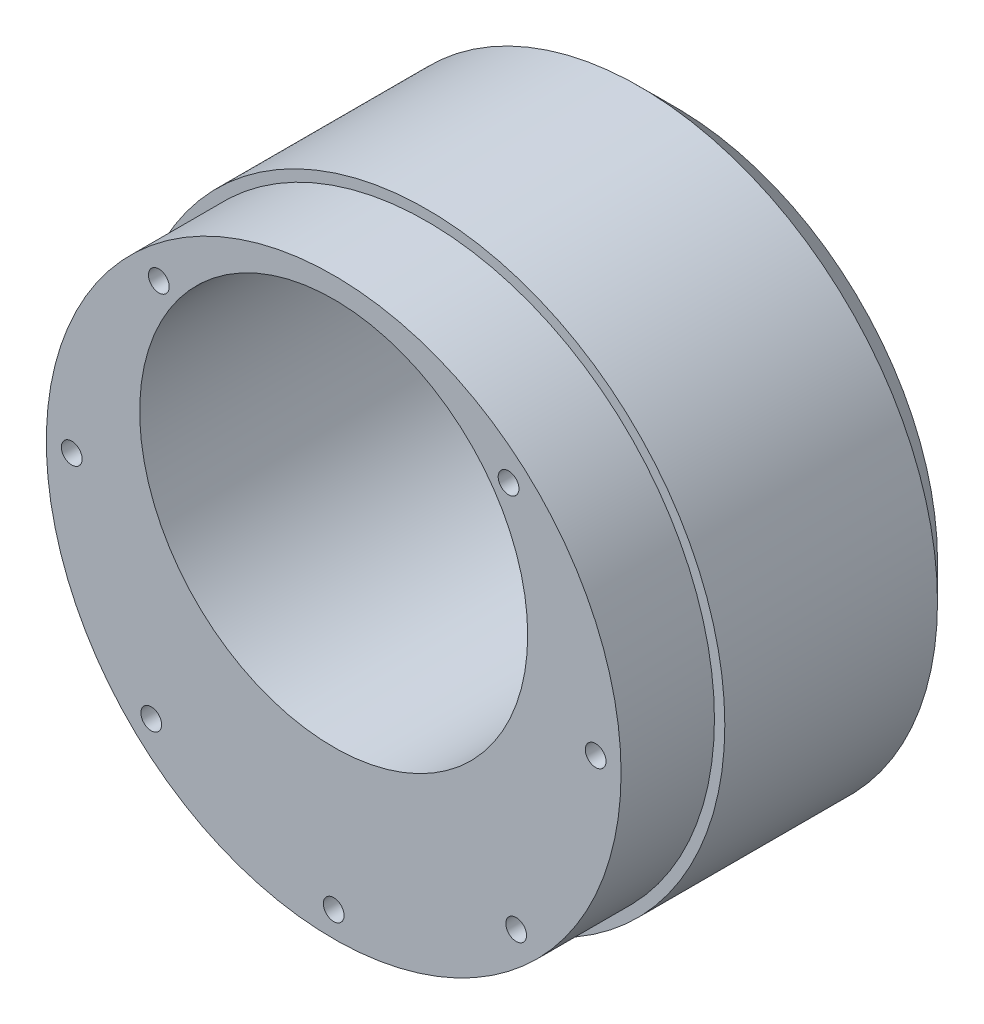
ISO-10303-21;
HEADER;
FILE_DESCRIPTION(('STEP AP214'),'2;1');
FILE_NAME('part.step','',(''),(''),'','','');
FILE_SCHEMA(('AUTOMOTIVE_DESIGN { 1 0 10303 214 1 1 1 1 }'));
ENDSEC;
DATA;
#1=APPLICATION_CONTEXT('core data for automotive mechanical design processes');
#2=APPLICATION_PROTOCOL_DEFINITION('international standard','automotive_design',2000,#1);
#3=PRODUCT_CONTEXT('',#1,'mechanical');
#4=PRODUCT('Part','Part','',(#3));
#5=PRODUCT_RELATED_PRODUCT_CATEGORY('part','',(#4));
#6=PRODUCT_DEFINITION_FORMATION('','',#4);
#7=PRODUCT_DEFINITION_CONTEXT('part definition',#1,'design');
#8=PRODUCT_DEFINITION('design','',#6,#7);
#9=PRODUCT_DEFINITION_SHAPE('','',#8);
#10=(LENGTH_UNIT() NAMED_UNIT(*) SI_UNIT(.MILLI.,.METRE.));
#11=(NAMED_UNIT(*) PLANE_ANGLE_UNIT() SI_UNIT($,.RADIAN.));
#12=(NAMED_UNIT(*) SI_UNIT($,.STERADIAN.) SOLID_ANGLE_UNIT());
#13=UNCERTAINTY_MEASURE_WITH_UNIT(LENGTH_MEASURE(1.E-05),#10,'distance_accuracy_value','');
#14=(GEOMETRIC_REPRESENTATION_CONTEXT(3) GLOBAL_UNCERTAINTY_ASSIGNED_CONTEXT((#13)) GLOBAL_UNIT_ASSIGNED_CONTEXT((#10,
#11,#12)) REPRESENTATION_CONTEXT('',''));
#15=CARTESIAN_POINT('',(0.,0.,0.));
#16=DIRECTION('',(0.,0.,1.));
#17=DIRECTION('',(1.,0.,0.));
#18=AXIS2_PLACEMENT_3D('',#15,#16,#17);
#19=CARTESIAN_POINT('',(15.5,7.,33.));
#20=DIRECTION('',(0.,0.,-1.));
#21=DIRECTION('',(-1.,0.,0.));
#22=AXIS2_PLACEMENT_3D('',#19,#20,#21);
#23=CYLINDRICAL_SURFACE('',#22,1.65);
#24=CARTESIAN_POINT('',(15.5,7.,3.50000000000003));
#25=DIRECTION('',(0.,0.,-1.));
#26=DIRECTION('',(-1.,0.,0.));
#27=AXIS2_PLACEMENT_3D('',#24,#25,#26);
#28=CIRCLE('',#27,1.65);
#29=CARTESIAN_POINT('',(13.85,7.,3.50000000000003));
#30=VERTEX_POINT('',#29);
#31=EDGE_CURVE('E73',#30,#30,#28,.T.);
#32=ORIENTED_EDGE('',*,*,#31,.T.);
#33=EDGE_LOOP('',(#32));
#34=FACE_BOUND('',#33,.T.);
#35=CARTESIAN_POINT('',(15.5,7.,6.));
#36=DIRECTION('',(0.,0.,1.));
#37=DIRECTION('',(1.,0.,0.));
#38=AXIS2_PLACEMENT_3D('',#35,#36,#37);
#39=CIRCLE('',#38,1.65);
#40=CARTESIAN_POINT('',(17.15,7.,6.));
#41=VERTEX_POINT('',#40);
#42=EDGE_CURVE('E93',#41,#41,#39,.T.);
#43=ORIENTED_EDGE('',*,*,#42,.T.);
#44=EDGE_LOOP('',(#43));
#45=FACE_BOUND('',#44,.T.);
#46=ADVANCED_FACE('F32',(#34,#45),#23,.F.);
#47=CARTESIAN_POINT('',(7.74999999999997,-6.42339375865882,33.));
#48=DIRECTION('',(0.,0.,-1.));
#49=DIRECTION('',(-1.,0.,0.));
#50=AXIS2_PLACEMENT_3D('',#47,#48,#49);
#51=CYLINDRICAL_SURFACE('',#50,1.65);
#52=CARTESIAN_POINT('',(7.74999999999997,-6.42339375865882,3.50000000000003));
#53=DIRECTION('',(0.,0.,-1.));
#54=DIRECTION('',(-1.,0.,0.));
#55=AXIS2_PLACEMENT_3D('',#52,#53,#54);
#56=CIRCLE('',#55,1.65);
#57=CARTESIAN_POINT('',(6.09999999999997,-6.42339375865882,3.50000000000003));
#58=VERTEX_POINT('',#57);
#59=EDGE_CURVE('E70',#58,#58,#56,.T.);
#60=ORIENTED_EDGE('',*,*,#59,.T.);
#61=EDGE_LOOP('',(#60));
#62=FACE_BOUND('',#61,.T.);
#63=CARTESIAN_POINT('',(7.74999999999997,-6.42339375865882,6.));
#64=DIRECTION('',(0.,0.,1.));
#65=DIRECTION('',(1.,0.,0.));
#66=AXIS2_PLACEMENT_3D('',#63,#64,#65);
#67=CIRCLE('',#66,1.65);
#68=CARTESIAN_POINT('',(9.39999999999996,-6.42339375865882,6.));
#69=VERTEX_POINT('',#68);
#70=EDGE_CURVE('E96',#69,#69,#67,.T.);
#71=ORIENTED_EDGE('',*,*,#70,.T.);
#72=EDGE_LOOP('',(#71));
#73=FACE_BOUND('',#72,.T.);
#74=ADVANCED_FACE('F250',(#62,#73),#51,.F.);
#75=CARTESIAN_POINT('',(-7.75000000000006,-6.42339375865876,33.));
#76=DIRECTION('',(0.,0.,-1.));
#77=DIRECTION('',(-1.,0.,0.));
#78=AXIS2_PLACEMENT_3D('',#75,#76,#77);
#79=CYLINDRICAL_SURFACE('',#78,1.65);
#80=CARTESIAN_POINT('',(-7.75000000000006,-6.42339375865876,3.50000000000003));
#81=DIRECTION('',(0.,0.,-1.));
#82=DIRECTION('',(-1.,0.,0.));
#83=AXIS2_PLACEMENT_3D('',#80,#81,#82);
#84=CIRCLE('',#83,1.65);
#85=CARTESIAN_POINT('',(-9.40000000000007,-6.42339375865876,3.50000000000003));
#86=VERTEX_POINT('',#85);
#87=EDGE_CURVE('E67',#86,#86,#84,.T.);
#88=ORIENTED_EDGE('',*,*,#87,.T.);
#89=EDGE_LOOP('',(#88));
#90=FACE_BOUND('',#89,.T.);
#91=CARTESIAN_POINT('',(-7.75000000000006,-6.42339375865876,6.));
#92=DIRECTION('',(0.,0.,1.));
#93=DIRECTION('',(1.,0.,0.));
#94=AXIS2_PLACEMENT_3D('',#91,#92,#93);
#95=CIRCLE('',#94,1.65);
#96=CARTESIAN_POINT('',(-6.10000000000006,-6.42339375865876,6.));
#97=VERTEX_POINT('',#96);
#98=EDGE_CURVE('E99',#97,#97,#95,.T.);
#99=ORIENTED_EDGE('',*,*,#98,.T.);
#100=EDGE_LOOP('',(#99));
#101=FACE_BOUND('',#100,.T.);
#102=ADVANCED_FACE('F256',(#90,#101),#79,.F.);
#103=CARTESIAN_POINT('',(-15.5,7.,33.));
#104=DIRECTION('',(0.,0.,-1.));
#105=DIRECTION('',(-1.,0.,0.));
#106=AXIS2_PLACEMENT_3D('',#103,#104,#105);
#107=CYLINDRICAL_SURFACE('',#106,1.64999999999997);
#108=CARTESIAN_POINT('',(-15.5,7.,3.50000000000003));
#109=DIRECTION('',(0.,0.,-1.));
#110=DIRECTION('',(-1.,0.,0.));
#111=AXIS2_PLACEMENT_3D('',#108,#109,#110);
#112=CIRCLE('',#111,1.64999999999997);
#113=CARTESIAN_POINT('',(-17.15,7.,3.50000000000003));
#114=VERTEX_POINT('',#113);
#115=EDGE_CURVE('E64',#114,#114,#112,.T.);
#116=ORIENTED_EDGE('',*,*,#115,.T.);
#117=EDGE_LOOP('',(#116));
#118=FACE_BOUND('',#117,.T.);
#119=CARTESIAN_POINT('',(-15.5,7.,6.));
#120=DIRECTION('',(0.,0.,1.));
#121=DIRECTION('',(1.,0.,0.));
#122=AXIS2_PLACEMENT_3D('',#119,#120,#121);
#123=CIRCLE('',#122,1.64999999999997);
#124=CARTESIAN_POINT('',(-13.85,7.,6.));
#125=VERTEX_POINT('',#124);
#126=EDGE_CURVE('E102',#125,#125,#123,.T.);
#127=ORIENTED_EDGE('',*,*,#126,.T.);
#128=EDGE_LOOP('',(#127));
#129=FACE_BOUND('',#128,.T.);
#130=ADVANCED_FACE('F300',(#118,#129),#107,.F.);
#131=CARTESIAN_POINT('',(-7.74999999999988,20.4233937586589,33.));
#132=DIRECTION('',(0.,0.,-1.));
#133=DIRECTION('',(-1.,0.,0.));
#134=AXIS2_PLACEMENT_3D('',#131,#132,#133);
#135=CYLINDRICAL_SURFACE('',#134,1.65);
#136=CARTESIAN_POINT('',(-7.74999999999988,20.4233937586589,3.50000000000003));
#137=DIRECTION('',(0.,0.,-1.));
#138=DIRECTION('',(-1.,0.,0.));
#139=AXIS2_PLACEMENT_3D('',#136,#137,#138);
#140=CIRCLE('',#139,1.65);
#141=CARTESIAN_POINT('',(-9.39999999999988,20.4233937586589,3.50000000000003));
#142=VERTEX_POINT('',#141);
#143=EDGE_CURVE('E61',#142,#142,#140,.T.);
#144=ORIENTED_EDGE('',*,*,#143,.T.);
#145=EDGE_LOOP('',(#144));
#146=FACE_BOUND('',#145,.T.);
#147=CARTESIAN_POINT('',(-7.74999999999988,20.4233937586589,6.));
#148=DIRECTION('',(0.,0.,1.));
#149=DIRECTION('',(1.,0.,0.));
#150=AXIS2_PLACEMENT_3D('',#147,#148,#149);
#151=CIRCLE('',#150,1.65);
#152=CARTESIAN_POINT('',(-6.09999999999987,20.4233937586589,6.));
#153=VERTEX_POINT('',#152);
#154=EDGE_CURVE('E86',#153,#153,#151,.T.);
#155=ORIENTED_EDGE('',*,*,#154,.T.);
#156=EDGE_LOOP('',(#155));
#157=FACE_BOUND('',#156,.T.);
#158=ADVANCED_FACE('F297',(#146,#157),#135,.F.);
#159=CARTESIAN_POINT('',(7.75000000000016,20.4233937586587,33.));
#160=DIRECTION('',(0.,0.,-1.));
#161=DIRECTION('',(-1.,0.,0.));
#162=AXIS2_PLACEMENT_3D('',#159,#160,#161);
#163=CYLINDRICAL_SURFACE('',#162,1.65);
#164=CARTESIAN_POINT('',(7.75000000000016,20.4233937586587,3.50000000000003));
#165=DIRECTION('',(0.,0.,-1.));
#166=DIRECTION('',(-1.,0.,0.));
#167=AXIS2_PLACEMENT_3D('',#164,#165,#166);
#168=CIRCLE('',#167,1.65);
#169=CARTESIAN_POINT('',(6.10000000000016,20.4233937586587,3.50000000000003));
#170=VERTEX_POINT('',#169);
#171=EDGE_CURVE('E58',#170,#170,#168,.T.);
#172=ORIENTED_EDGE('',*,*,#171,.T.);
#173=EDGE_LOOP('',(#172));
#174=FACE_BOUND('',#173,.T.);
#175=CARTESIAN_POINT('',(7.75000000000016,20.4233937586587,6.));
#176=DIRECTION('',(0.,0.,1.));
#177=DIRECTION('',(1.,0.,0.));
#178=AXIS2_PLACEMENT_3D('',#175,#176,#177);
#179=CIRCLE('',#178,1.65);
#180=CARTESIAN_POINT('',(9.40000000000015,20.4233937586587,6.));
#181=VERTEX_POINT('',#180);
#182=EDGE_CURVE('E83',#181,#181,#179,.T.);
#183=ORIENTED_EDGE('',*,*,#182,.T.);
#184=EDGE_LOOP('',(#183));
#185=FACE_BOUND('',#184,.T.);
#186=ADVANCED_FACE('F230',(#174,#185),#163,.F.);
#187=CARTESIAN_POINT('',(0.,0.,33.));
#188=DIRECTION('',(0.,0.,1.));
#189=DIRECTION('',(1.,0.,0.));
#190=AXIS2_PLACEMENT_3D('',#187,#188,#189);
#191=PLANE('',#190);
#192=CARTESIAN_POINT('',(0.,-25.25,33.));
#193=DIRECTION('',(0.,0.,1.));
#194=DIRECTION('',(1.,0.,0.));
#195=AXIS2_PLACEMENT_3D('',#192,#193,#194);
#196=CIRCLE('',#195,1.);
#197=CARTESIAN_POINT('',(1.,-25.25,33.));
#198=VERTEX_POINT('',#197);
#199=EDGE_CURVE('E159',#198,#198,#196,.T.);
#200=ORIENTED_EDGE('',*,*,#199,.F.);
#201=EDGE_LOOP('',(#200));
#202=FACE_BOUND('',#201,.T.);
#203=CARTESIAN_POINT('',(-25.248910365322,0.234574857846225,33.));
#204=DIRECTION('',(0.,0.,1.));
#205=DIRECTION('',(1.,0.,0.));
#206=AXIS2_PLACEMENT_3D('',#203,#204,#205);
#207=CIRCLE('',#206,1.);
#208=CARTESIAN_POINT('',(-24.248910365322,0.234574857846225,33.));
#209=VERTEX_POINT('',#208);
#210=EDGE_CURVE('E153',#209,#209,#207,.T.);
#211=ORIENTED_EDGE('',*,*,#210,.F.);
#212=EDGE_LOOP('',(#211));
#213=FACE_BOUND('',#212,.T.);
#214=CARTESIAN_POINT('',(-17.5874610528321,-18.1174974462566,33.));
#215=DIRECTION('',(0.,0.,1.));
#216=DIRECTION('',(1.,0.,0.));
#217=AXIS2_PLACEMENT_3D('',#214,#215,#216);
#218=CIRCLE('',#217,1.);
#219=CARTESIAN_POINT('',(-16.5874610528321,-18.1174974462566,33.));
#220=VERTEX_POINT('',#219);
#221=EDGE_CURVE('E147',#220,#220,#218,.T.);
#222=ORIENTED_EDGE('',*,*,#221,.F.);
#223=EDGE_LOOP('',(#222));
#224=FACE_BOUND('',#223,.T.);
#225=CARTESIAN_POINT('',(17.5874610528321,-18.1174974462566,33.));
#226=DIRECTION('',(0.,0.,1.));
#227=DIRECTION('',(-1.,0.,0.));
#228=AXIS2_PLACEMENT_3D('',#225,#226,#227);
#229=CIRCLE('',#228,1.);
#230=CARTESIAN_POINT('',(16.5874610528321,-18.1174974462566,33.));
#231=VERTEX_POINT('',#230);
#232=EDGE_CURVE('E141',#231,#231,#229,.T.);
#233=ORIENTED_EDGE('',*,*,#232,.F.);
#234=EDGE_LOOP('',(#233));
#235=FACE_BOUND('',#234,.T.);
#236=CARTESIAN_POINT('',(25.248910365322,0.234574857846231,33.));
#237=DIRECTION('',(0.,0.,1.));
#238=DIRECTION('',(-1.,0.,0.));
#239=AXIS2_PLACEMENT_3D('',#236,#237,#238);
#240=CIRCLE('',#239,1.);
#241=CARTESIAN_POINT('',(24.248910365322,0.234574857846231,33.));
#242=VERTEX_POINT('',#241);
#243=EDGE_CURVE('E135',#242,#242,#240,.T.);
#244=ORIENTED_EDGE('',*,*,#243,.F.);
#245=EDGE_LOOP('',(#244));
#246=FACE_BOUND('',#245,.T.);
#247=CARTESIAN_POINT('',(-16.8542728802784,18.8014889218145,33.));
#248=DIRECTION('',(0.,0.,1.));
#249=DIRECTION('',(1.,0.,0.));
#250=AXIS2_PLACEMENT_3D('',#247,#248,#249);
#251=CIRCLE('',#250,1.);
#252=CARTESIAN_POINT('',(-15.8542728802784,18.8014889218145,33.));
#253=VERTEX_POINT('',#252);
#254=EDGE_CURVE('E129',#253,#253,#251,.T.);
#255=ORIENTED_EDGE('',*,*,#254,.F.);
#256=EDGE_LOOP('',(#255));
#257=FACE_BOUND('',#256,.T.);
#258=CARTESIAN_POINT('',(16.8542728802784,18.8014889218145,33.));
#259=DIRECTION('',(0.,0.,1.));
#260=DIRECTION('',(-1.,0.,0.));
#261=AXIS2_PLACEMENT_3D('',#258,#259,#260);
#262=CIRCLE('',#261,1.);
#263=CARTESIAN_POINT('',(15.8542728802784,18.8014889218145,33.));
#264=VERTEX_POINT('',#263);
#265=EDGE_CURVE('E122',#264,#264,#262,.T.);
#266=ORIENTED_EDGE('',*,*,#265,.F.);
#267=EDGE_LOOP('',(#266));
#268=FACE_BOUND('',#267,.T.);
#269=CARTESIAN_POINT('',(0.,7.,33.));
#270=DIRECTION('',(0.,0.,1.));
#271=DIRECTION('',(1.,0.,0.));
#272=AXIS2_PLACEMENT_3D('',#269,#270,#271);
#273=CIRCLE('',#272,18.7);
#274=CARTESIAN_POINT('',(18.7,7.,33.));
#275=VERTEX_POINT('',#274);
#276=EDGE_CURVE('E107',#275,#275,#273,.T.);
#277=ORIENTED_EDGE('',*,*,#276,.F.);
#278=EDGE_LOOP('',(#277));
#279=FACE_BOUND('',#278,.T.);
#280=CARTESIAN_POINT('',(0.,0.,33.));
#281=DIRECTION('',(0.,0.,1.));
#282=DIRECTION('',(1.,0.,0.));
#283=AXIS2_PLACEMENT_3D('',#280,#281,#282);
#284=CIRCLE('',#283,27.7);
#285=CARTESIAN_POINT('',(27.7,0.,33.));
#286=VERTEX_POINT('',#285);
#287=EDGE_CURVE('E116',#286,#286,#284,.T.);
#288=ORIENTED_EDGE('',*,*,#287,.T.);
#289=EDGE_LOOP('',(#288));
#290=FACE_BOUND('',#289,.T.);
#291=ADVANCED_FACE('F227',(#202,#213,#224,#235,#246,#257,#268,#279,#290),#191,.T.);
#292=CARTESIAN_POINT('',(0.,0.,33.));
#293=DIRECTION('',(0.,0.,-1.));
#294=DIRECTION('',(-1.,0.,0.));
#295=AXIS2_PLACEMENT_3D('',#292,#293,#294);
#296=CYLINDRICAL_SURFACE('',#295,28.7);
#297=CARTESIAN_POINT('',(0.,0.,3.50000000000001));
#298=DIRECTION('',(0.,0.,1.));
#299=DIRECTION('',(1.,0.,0.));
#300=AXIS2_PLACEMENT_3D('',#297,#298,#299);
#301=CIRCLE('',#300,28.7);
#302=CARTESIAN_POINT('',(28.7,0.,3.50000000000001));
#303=VERTEX_POINT('',#302);
#304=EDGE_CURVE('E79',#303,#303,#301,.T.);
#305=ORIENTED_EDGE('',*,*,#304,.T.);
#306=EDGE_LOOP('',(#305));
#307=FACE_BOUND('',#306,.T.);
#308=CARTESIAN_POINT('',(0.,0.,24.));
#309=DIRECTION('',(0.,0.,1.));
#310=DIRECTION('',(1.,0.,0.));
#311=AXIS2_PLACEMENT_3D('',#308,#309,#310);
#312=CIRCLE('',#311,28.7);
#313=CARTESIAN_POINT('',(28.7,0.,24.));
#314=VERTEX_POINT('',#313);
#315=EDGE_CURVE('E110',#314,#314,#312,.T.);
#316=ORIENTED_EDGE('',*,*,#315,.F.);
#317=EDGE_LOOP('',(#316));
#318=FACE_BOUND('',#317,.T.);
#319=ADVANCED_FACE('F199',(#307,#318),#296,.T.);
#320=CARTESIAN_POINT('',(0.,0.,33.));
#321=DIRECTION('',(0.,0.,-1.));
#322=DIRECTION('',(-1.,0.,0.));
#323=AXIS2_PLACEMENT_3D('',#320,#321,#322);
#324=CYLINDRICAL_SURFACE('',#323,6.15);
#325=CARTESIAN_POINT('',(0.,0.,0.));
#326=DIRECTION('',(0.,0.,1.));
#327=DIRECTION('',(1.,0.,0.));
#328=AXIS2_PLACEMENT_3D('',#325,#326,#327);
#329=CIRCLE('',#328,6.15);
#330=CARTESIAN_POINT('',(6.15,0.,0.));
#331=VERTEX_POINT('',#330);
#332=EDGE_CURVE('E82',#331,#331,#329,.T.);
#333=ORIENTED_EDGE('',*,*,#332,.F.);
#334=EDGE_LOOP('',(#333));
#335=FACE_BOUND('',#334,.T.);
#336=CARTESIAN_POINT('',(0.,0.,6.));
#337=DIRECTION('',(0.,0.,1.));
#338=DIRECTION('',(1.,0.,0.));
#339=AXIS2_PLACEMENT_3D('',#336,#337,#338);
#340=CIRCLE('',#339,6.15);
#341=CARTESIAN_POINT('',(6.15,0.,6.));
#342=VERTEX_POINT('',#341);
#343=EDGE_CURVE('E90',#342,#342,#340,.T.);
#344=ORIENTED_EDGE('',*,*,#343,.T.);
#345=EDGE_LOOP('',(#344));
#346=FACE_BOUND('',#345,.T.);
#347=ADVANCED_FACE('F188',(#335,#346),#324,.F.);
#348=CARTESIAN_POINT('',(0.,0.,0.));
#349=DIRECTION('',(0.,0.,1.));
#350=DIRECTION('',(1.,0.,0.));
#351=AXIS2_PLACEMENT_3D('',#348,#349,#350);
#352=PLANE('',#351);
#353=CARTESIAN_POINT('',(15.5,7.,0.));
#354=DIRECTION('',(0.,0.,-1.));
#355=DIRECTION('',(-1.,0.,0.));
#356=AXIS2_PLACEMENT_3D('',#353,#354,#355);
#357=CIRCLE('',#356,3.);
#358=CARTESIAN_POINT('',(12.5,7.,0.));
#359=VERTEX_POINT('',#358);
#360=EDGE_CURVE('E167',#359,#359,#357,.T.);
#361=ORIENTED_EDGE('',*,*,#360,.F.);
#362=EDGE_LOOP('',(#361));
#363=FACE_BOUND('',#362,.T.);
#364=CARTESIAN_POINT('',(7.74999999999997,-6.42339375865882,0.));
#365=DIRECTION('',(0.,0.,-1.));
#366=DIRECTION('',(-1.,0.,0.));
#367=AXIS2_PLACEMENT_3D('',#364,#365,#366);
#368=CIRCLE('',#367,3.);
#369=CARTESIAN_POINT('',(4.74999999999997,-6.42339375865882,0.));
#370=VERTEX_POINT('',#369);
#371=EDGE_CURVE('E170',#370,#370,#368,.T.);
#372=ORIENTED_EDGE('',*,*,#371,.F.);
#373=EDGE_LOOP('',(#372));
#374=FACE_BOUND('',#373,.T.);
#375=CARTESIAN_POINT('',(-7.75000000000006,-6.42339375865876,0.));
#376=DIRECTION('',(0.,0.,-1.));
#377=DIRECTION('',(-1.,0.,0.));
#378=AXIS2_PLACEMENT_3D('',#375,#376,#377);
#379=CIRCLE('',#378,3.);
#380=CARTESIAN_POINT('',(-10.7500000000001,-6.42339375865876,0.));
#381=VERTEX_POINT('',#380);
#382=EDGE_CURVE('E173',#381,#381,#379,.T.);
#383=ORIENTED_EDGE('',*,*,#382,.F.);
#384=EDGE_LOOP('',(#383));
#385=FACE_BOUND('',#384,.T.);
#386=CARTESIAN_POINT('',(-15.5,7.,0.));
#387=DIRECTION('',(0.,0.,-1.));
#388=DIRECTION('',(-1.,0.,0.));
#389=AXIS2_PLACEMENT_3D('',#386,#387,#388);
#390=CIRCLE('',#389,3.);
#391=CARTESIAN_POINT('',(-18.5,7.,0.));
#392=VERTEX_POINT('',#391);
#393=EDGE_CURVE('E176',#392,#392,#390,.T.);
#394=ORIENTED_EDGE('',*,*,#393,.F.);
#395=EDGE_LOOP('',(#394));
#396=FACE_BOUND('',#395,.T.);
#397=CARTESIAN_POINT('',(-7.74999999999988,20.4233937586589,0.));
#398=DIRECTION('',(0.,0.,-1.));
#399=DIRECTION('',(-1.,0.,0.));
#400=AXIS2_PLACEMENT_3D('',#397,#398,#399);
#401=CIRCLE('',#400,3.);
#402=CARTESIAN_POINT('',(-10.7499999999999,20.4233937586589,0.));
#403=VERTEX_POINT('',#402);
#404=EDGE_CURVE('E166',#403,#403,#401,.T.);
#405=ORIENTED_EDGE('',*,*,#404,.F.);
#406=EDGE_LOOP('',(#405));
#407=FACE_BOUND('',#406,.T.);
#408=CARTESIAN_POINT('',(7.75000000000016,20.4233937586587,0.));
#409=DIRECTION('',(0.,0.,-1.));
#410=DIRECTION('',(-1.,0.,0.));
#411=AXIS2_PLACEMENT_3D('',#408,#409,#410);
#412=CIRCLE('',#411,3.);
#413=CARTESIAN_POINT('',(4.75000000000016,20.4233937586587,0.));
#414=VERTEX_POINT('',#413);
#415=EDGE_CURVE('E126',#414,#414,#412,.T.);
#416=ORIENTED_EDGE('',*,*,#415,.F.);
#417=EDGE_LOOP('',(#416));
#418=FACE_BOUND('',#417,.T.);
#419=CARTESIAN_POINT('',(0.,0.,0.));
#420=DIRECTION('',(0.,0.,1.));
#421=DIRECTION('',(1.,0.,0.));
#422=AXIS2_PLACEMENT_3D('',#419,#420,#421);
#423=CIRCLE('',#422,25.2);
#424=CARTESIAN_POINT('',(25.2,0.,0.));
#425=VERTEX_POINT('',#424);
#426=EDGE_CURVE('E76',#425,#425,#423,.F.);
#427=ORIENTED_EDGE('',*,*,#426,.T.);
#428=EDGE_LOOP('',(#427));
#429=FACE_BOUND('',#428,.T.);
#430=ORIENTED_EDGE('',*,*,#332,.T.);
#431=EDGE_LOOP('',(#430));
#432=FACE_BOUND('',#431,.T.);
#433=ADVANCED_FACE('F184',(#363,#374,#385,#396,#407,#418,#429,#432),#352,.F.);
#434=CARTESIAN_POINT('',(0.,7.,6.));
#435=DIRECTION('',(0.,0.,1.));
#436=DIRECTION('',(1.,0.,0.));
#437=AXIS2_PLACEMENT_3D('',#434,#435,#436);
#438=CYLINDRICAL_SURFACE('',#437,18.7);
#439=CARTESIAN_POINT('',(0.,7.,6.));
#440=DIRECTION('',(0.,0.,1.));
#441=DIRECTION('',(1.,0.,0.));
#442=AXIS2_PLACEMENT_3D('',#439,#440,#441);
#443=CIRCLE('',#442,18.7);
#444=CARTESIAN_POINT('',(18.7,7.,6.));
#445=VERTEX_POINT('',#444);
#446=EDGE_CURVE('E87',#445,#445,#443,.T.);
#447=ORIENTED_EDGE('',*,*,#446,.F.);
#448=EDGE_LOOP('',(#447));
#449=FACE_BOUND('',#448,.T.);
#450=ORIENTED_EDGE('',*,*,#276,.T.);
#451=EDGE_LOOP('',(#450));
#452=FACE_BOUND('',#451,.T.);
#453=ADVANCED_FACE('F187',(#449,#452),#438,.F.);
#454=CARTESIAN_POINT('',(0.,7.,6.));
#455=DIRECTION('',(0.,0.,1.));
#456=DIRECTION('',(1.,0.,0.));
#457=AXIS2_PLACEMENT_3D('',#454,#455,#456);
#458=PLANE('',#457);
#459=ORIENTED_EDGE('',*,*,#343,.F.);
#460=EDGE_LOOP('',(#459));
#461=FACE_BOUND('',#460,.T.);
#462=ORIENTED_EDGE('',*,*,#42,.F.);
#463=EDGE_LOOP('',(#462));
#464=FACE_BOUND('',#463,.T.);
#465=ORIENTED_EDGE('',*,*,#70,.F.);
#466=EDGE_LOOP('',(#465));
#467=FACE_BOUND('',#466,.T.);
#468=ORIENTED_EDGE('',*,*,#98,.F.);
#469=EDGE_LOOP('',(#468));
#470=FACE_BOUND('',#469,.T.);
#471=ORIENTED_EDGE('',*,*,#126,.F.);
#472=EDGE_LOOP('',(#471));
#473=FACE_BOUND('',#472,.T.);
#474=ORIENTED_EDGE('',*,*,#154,.F.);
#475=EDGE_LOOP('',(#474));
#476=FACE_BOUND('',#475,.T.);
#477=ORIENTED_EDGE('',*,*,#182,.F.);
#478=EDGE_LOOP('',(#477));
#479=FACE_BOUND('',#478,.T.);
#480=ORIENTED_EDGE('',*,*,#446,.T.);
#481=EDGE_LOOP('',(#480));
#482=FACE_BOUND('',#481,.T.);
#483=ADVANCED_FACE('F203',(#461,#464,#467,#470,#473,#476,#479,#482),#458,.T.);
#484=CARTESIAN_POINT('',(0.,0.,24.));
#485=DIRECTION('',(0.,0.,1.));
#486=DIRECTION('',(1.,0.,0.));
#487=AXIS2_PLACEMENT_3D('',#484,#485,#486);
#488=PLANE('',#487);
#489=CARTESIAN_POINT('',(0.,0.,24.));
#490=DIRECTION('',(0.,0.,1.));
#491=DIRECTION('',(1.,0.,0.));
#492=AXIS2_PLACEMENT_3D('',#489,#490,#491);
#493=CIRCLE('',#492,27.7);
#494=CARTESIAN_POINT('',(27.7,0.,24.));
#495=VERTEX_POINT('',#494);
#496=EDGE_CURVE('E115',#495,#495,#493,.T.);
#497=ORIENTED_EDGE('',*,*,#496,.F.);
#498=EDGE_LOOP('',(#497));
#499=FACE_BOUND('',#498,.T.);
#500=ORIENTED_EDGE('',*,*,#315,.T.);
#501=EDGE_LOOP('',(#500));
#502=FACE_BOUND('',#501,.T.);
#503=ADVANCED_FACE('F206',(#499,#502),#488,.T.);
#504=CARTESIAN_POINT('',(0.,0.,24.));
#505=DIRECTION('',(0.,0.,1.));
#506=DIRECTION('',(1.,0.,0.));
#507=AXIS2_PLACEMENT_3D('',#504,#505,#506);
#508=CYLINDRICAL_SURFACE('',#507,27.7);
#509=ORIENTED_EDGE('',*,*,#496,.T.);
#510=EDGE_LOOP('',(#509));
#511=FACE_BOUND('',#510,.T.);
#512=ORIENTED_EDGE('',*,*,#287,.F.);
#513=EDGE_LOOP('',(#512));
#514=FACE_BOUND('',#513,.T.);
#515=ADVANCED_FACE('F235',(#511,#514),#508,.T.);
#516=CARTESIAN_POINT('',(16.8542728802784,18.8014889218145,23.));
#517=DIRECTION('',(0.,0.,1.));
#518=DIRECTION('',(1.,0.,0.));
#519=AXIS2_PLACEMENT_3D('',#516,#517,#518);
#520=CYLINDRICAL_SURFACE('',#519,1.);
#521=CARTESIAN_POINT('',(16.8542728802784,18.8014889218145,23.));
#522=DIRECTION('',(0.,0.,1.));
#523=DIRECTION('',(-1.,0.,0.));
#524=AXIS2_PLACEMENT_3D('',#521,#522,#523);
#525=CIRCLE('',#524,1.);
#526=CARTESIAN_POINT('',(15.8542728802784,18.8014889218145,23.));
#527=VERTEX_POINT('',#526);
#528=EDGE_CURVE('E125',#527,#527,#525,.T.);
#529=ORIENTED_EDGE('',*,*,#528,.F.);
#530=EDGE_LOOP('',(#529));
#531=FACE_BOUND('',#530,.T.);
#532=ORIENTED_EDGE('',*,*,#265,.T.);
#533=EDGE_LOOP('',(#532));
#534=FACE_BOUND('',#533,.T.);
#535=ADVANCED_FACE('F237',(#531,#534),#520,.F.);
#536=CARTESIAN_POINT('',(16.8542728802784,18.8014889218145,23.));
#537=DIRECTION('',(0.,0.,-1.));
#538=DIRECTION('',(-1.,0.,0.));
#539=AXIS2_PLACEMENT_3D('',#536,#537,#538);
#540=PLANE('',#539);
#541=ORIENTED_EDGE('',*,*,#528,.T.);
#542=EDGE_LOOP('',(#541));
#543=FACE_BOUND('',#542,.T.);
#544=ADVANCED_FACE('F244',(#543),#540,.F.);
#545=CARTESIAN_POINT('',(-16.8542728802784,18.8014889218145,23.));
#546=DIRECTION('',(0.,0.,1.));
#547=DIRECTION('',(1.,0.,0.));
#548=AXIS2_PLACEMENT_3D('',#545,#546,#547);
#549=CYLINDRICAL_SURFACE('',#548,1.);
#550=CARTESIAN_POINT('',(-16.8542728802784,18.8014889218145,23.));
#551=DIRECTION('',(0.,0.,1.));
#552=DIRECTION('',(1.,0.,0.));
#553=AXIS2_PLACEMENT_3D('',#550,#551,#552);
#554=CIRCLE('',#553,1.);
#555=CARTESIAN_POINT('',(-15.8542728802784,18.8014889218145,23.));
#556=VERTEX_POINT('',#555);
#557=EDGE_CURVE('E132',#556,#556,#554,.T.);
#558=ORIENTED_EDGE('',*,*,#557,.F.);
#559=EDGE_LOOP('',(#558));
#560=FACE_BOUND('',#559,.T.);
#561=ORIENTED_EDGE('',*,*,#254,.T.);
#562=EDGE_LOOP('',(#561));
#563=FACE_BOUND('',#562,.T.);
#564=ADVANCED_FACE('F472',(#560,#563),#549,.F.);
#565=CARTESIAN_POINT('',(-16.8542728802784,18.8014889218145,23.));
#566=DIRECTION('',(0.,0.,1.));
#567=DIRECTION('',(1.,0.,0.));
#568=AXIS2_PLACEMENT_3D('',#565,#566,#567);
#569=PLANE('',#568);
#570=ORIENTED_EDGE('',*,*,#557,.T.);
#571=EDGE_LOOP('',(#570));
#572=FACE_BOUND('',#571,.T.);
#573=ADVANCED_FACE('F468',(#572),#569,.T.);
#574=CARTESIAN_POINT('',(25.248910365322,0.234574857846231,23.));
#575=DIRECTION('',(0.,0.,1.));
#576=DIRECTION('',(1.,0.,0.));
#577=AXIS2_PLACEMENT_3D('',#574,#575,#576);
#578=CYLINDRICAL_SURFACE('',#577,1.);
#579=CARTESIAN_POINT('',(25.248910365322,0.234574857846231,23.));
#580=DIRECTION('',(0.,0.,1.));
#581=DIRECTION('',(-1.,0.,0.));
#582=AXIS2_PLACEMENT_3D('',#579,#580,#581);
#583=CIRCLE('',#582,1.);
#584=CARTESIAN_POINT('',(24.248910365322,0.234574857846231,23.));
#585=VERTEX_POINT('',#584);
#586=EDGE_CURVE('E138',#585,#585,#583,.T.);
#587=ORIENTED_EDGE('',*,*,#586,.F.);
#588=EDGE_LOOP('',(#587));
#589=FACE_BOUND('',#588,.T.);
#590=ORIENTED_EDGE('',*,*,#243,.T.);
#591=EDGE_LOOP('',(#590));
#592=FACE_BOUND('',#591,.T.);
#593=ADVANCED_FACE('F464',(#589,#592),#578,.F.);
#594=CARTESIAN_POINT('',(25.248910365322,0.234574857846231,23.));
#595=DIRECTION('',(0.,0.,-1.));
#596=DIRECTION('',(-1.,0.,0.));
#597=AXIS2_PLACEMENT_3D('',#594,#595,#596);
#598=PLANE('',#597);
#599=ORIENTED_EDGE('',*,*,#586,.T.);
#600=EDGE_LOOP('',(#599));
#601=FACE_BOUND('',#600,.T.);
#602=ADVANCED_FACE('F460',(#601),#598,.F.);
#603=CARTESIAN_POINT('',(17.5874610528321,-18.1174974462566,23.));
#604=DIRECTION('',(0.,0.,1.));
#605=DIRECTION('',(1.,0.,0.));
#606=AXIS2_PLACEMENT_3D('',#603,#604,#605);
#607=CYLINDRICAL_SURFACE('',#606,1.);
#608=CARTESIAN_POINT('',(17.5874610528321,-18.1174974462566,23.));
#609=DIRECTION('',(0.,0.,1.));
#610=DIRECTION('',(-1.,0.,0.));
#611=AXIS2_PLACEMENT_3D('',#608,#609,#610);
#612=CIRCLE('',#611,1.);
#613=CARTESIAN_POINT('',(16.5874610528321,-18.1174974462566,23.));
#614=VERTEX_POINT('',#613);
#615=EDGE_CURVE('E144',#614,#614,#612,.T.);
#616=ORIENTED_EDGE('',*,*,#615,.F.);
#617=EDGE_LOOP('',(#616));
#618=FACE_BOUND('',#617,.T.);
#619=ORIENTED_EDGE('',*,*,#232,.T.);
#620=EDGE_LOOP('',(#619));
#621=FACE_BOUND('',#620,.T.);
#622=ADVANCED_FACE('F456',(#618,#621),#607,.F.);
#623=CARTESIAN_POINT('',(17.5874610528321,-18.1174974462566,23.));
#624=DIRECTION('',(0.,0.,-1.));
#625=DIRECTION('',(-1.,0.,0.));
#626=AXIS2_PLACEMENT_3D('',#623,#624,#625);
#627=PLANE('',#626);
#628=ORIENTED_EDGE('',*,*,#615,.T.);
#629=EDGE_LOOP('',(#628));
#630=FACE_BOUND('',#629,.T.);
#631=ADVANCED_FACE('F452',(#630),#627,.F.);
#632=CARTESIAN_POINT('',(-17.5874610528321,-18.1174974462566,23.));
#633=DIRECTION('',(0.,0.,1.));
#634=DIRECTION('',(1.,0.,0.));
#635=AXIS2_PLACEMENT_3D('',#632,#633,#634);
#636=CYLINDRICAL_SURFACE('',#635,1.);
#637=CARTESIAN_POINT('',(-17.5874610528321,-18.1174974462566,23.));
#638=DIRECTION('',(0.,0.,1.));
#639=DIRECTION('',(1.,0.,0.));
#640=AXIS2_PLACEMENT_3D('',#637,#638,#639);
#641=CIRCLE('',#640,1.);
#642=CARTESIAN_POINT('',(-16.5874610528321,-18.1174974462566,23.));
#643=VERTEX_POINT('',#642);
#644=EDGE_CURVE('E150',#643,#643,#641,.T.);
#645=ORIENTED_EDGE('',*,*,#644,.F.);
#646=EDGE_LOOP('',(#645));
#647=FACE_BOUND('',#646,.T.);
#648=ORIENTED_EDGE('',*,*,#221,.T.);
#649=EDGE_LOOP('',(#648));
#650=FACE_BOUND('',#649,.T.);
#651=ADVANCED_FACE('F448',(#647,#650),#636,.F.);
#652=CARTESIAN_POINT('',(-17.5874610528321,-18.1174974462566,23.));
#653=DIRECTION('',(0.,0.,1.));
#654=DIRECTION('',(1.,0.,0.));
#655=AXIS2_PLACEMENT_3D('',#652,#653,#654);
#656=PLANE('',#655);
#657=ORIENTED_EDGE('',*,*,#644,.T.);
#658=EDGE_LOOP('',(#657));
#659=FACE_BOUND('',#658,.T.);
#660=ADVANCED_FACE('F444',(#659),#656,.T.);
#661=CARTESIAN_POINT('',(-25.248910365322,0.234574857846225,23.));
#662=DIRECTION('',(0.,0.,1.));
#663=DIRECTION('',(1.,0.,0.));
#664=AXIS2_PLACEMENT_3D('',#661,#662,#663);
#665=CYLINDRICAL_SURFACE('',#664,1.);
#666=CARTESIAN_POINT('',(-25.248910365322,0.234574857846225,23.));
#667=DIRECTION('',(0.,0.,1.));
#668=DIRECTION('',(1.,0.,0.));
#669=AXIS2_PLACEMENT_3D('',#666,#667,#668);
#670=CIRCLE('',#669,1.);
#671=CARTESIAN_POINT('',(-24.248910365322,0.234574857846225,23.));
#672=VERTEX_POINT('',#671);
#673=EDGE_CURVE('E156',#672,#672,#670,.T.);
#674=ORIENTED_EDGE('',*,*,#673,.F.);
#675=EDGE_LOOP('',(#674));
#676=FACE_BOUND('',#675,.T.);
#677=ORIENTED_EDGE('',*,*,#210,.T.);
#678=EDGE_LOOP('',(#677));
#679=FACE_BOUND('',#678,.T.);
#680=ADVANCED_FACE('F440',(#676,#679),#665,.F.);
#681=CARTESIAN_POINT('',(-25.248910365322,0.234574857846225,23.));
#682=DIRECTION('',(0.,0.,1.));
#683=DIRECTION('',(1.,0.,0.));
#684=AXIS2_PLACEMENT_3D('',#681,#682,#683);
#685=PLANE('',#684);
#686=ORIENTED_EDGE('',*,*,#673,.T.);
#687=EDGE_LOOP('',(#686));
#688=FACE_BOUND('',#687,.T.);
#689=ADVANCED_FACE('F436',(#688),#685,.T.);
#690=CARTESIAN_POINT('',(0.,-25.25,23.));
#691=DIRECTION('',(0.,0.,1.));
#692=DIRECTION('',(1.,0.,0.));
#693=AXIS2_PLACEMENT_3D('',#690,#691,#692);
#694=CYLINDRICAL_SURFACE('',#693,1.);
#695=CARTESIAN_POINT('',(0.,-25.25,23.));
#696=DIRECTION('',(0.,0.,1.));
#697=DIRECTION('',(1.,0.,0.));
#698=AXIS2_PLACEMENT_3D('',#695,#696,#697);
#699=CIRCLE('',#698,1.);
#700=CARTESIAN_POINT('',(1.,-25.25,23.));
#701=VERTEX_POINT('',#700);
#702=EDGE_CURVE('E119',#701,#701,#699,.T.);
#703=ORIENTED_EDGE('',*,*,#702,.F.);
#704=EDGE_LOOP('',(#703));
#705=FACE_BOUND('',#704,.T.);
#706=ORIENTED_EDGE('',*,*,#199,.T.);
#707=EDGE_LOOP('',(#706));
#708=FACE_BOUND('',#707,.T.);
#709=ADVANCED_FACE('F432',(#705,#708),#694,.F.);
#710=CARTESIAN_POINT('',(0.,-25.25,23.));
#711=DIRECTION('',(0.,0.,1.));
#712=DIRECTION('',(1.,0.,0.));
#713=AXIS2_PLACEMENT_3D('',#710,#711,#712);
#714=PLANE('',#713);
#715=ORIENTED_EDGE('',*,*,#702,.T.);
#716=EDGE_LOOP('',(#715));
#717=FACE_BOUND('',#716,.T.);
#718=ADVANCED_FACE('F269',(#717),#714,.T.);
#719=CARTESIAN_POINT('',(0.,0.,3.50000000000001));
#720=DIRECTION('',(0.,0.,1.));
#721=DIRECTION('',(1.,0.,0.));
#722=AXIS2_PLACEMENT_3D('',#719,#720,#721);
#723=CONICAL_SURFACE('',#722,28.7,0.785398163397449);
#724=CARTESIAN_POINT('',(25.2,0.,0.));
#725=CARTESIAN_POINT('',(25.2364583333333,0.,0.0364583333333323));
#726=CARTESIAN_POINT('',(25.2729166666667,0.,0.0729166666666661));
#727=CARTESIAN_POINT('',(25.3458333333333,0.,0.145833333333333));
#728=CARTESIAN_POINT('',(25.3822916666667,0.,0.182291666666667));
#729=CARTESIAN_POINT('',(25.4552083333333,0.,0.255208333333334));
#730=CARTESIAN_POINT('',(25.4916666666667,0.,0.291666666666667));
#731=CARTESIAN_POINT('',(25.5645833333333,0.,0.364583333333334));
#732=CARTESIAN_POINT('',(25.6010416666667,0.,0.401041666666668));
#733=CARTESIAN_POINT('',(25.6739583333333,0.,0.473958333333335));
#734=CARTESIAN_POINT('',(25.7104166666667,0.,0.510416666666668));
#735=CARTESIAN_POINT('',(25.7833333333333,0.,0.583333333333335));
#736=CARTESIAN_POINT('',(25.8197916666667,0.,0.619791666666668));
#737=CARTESIAN_POINT('',(25.8927083333333,0.,0.692708333333335));
#738=CARTESIAN_POINT('',(25.9291666666667,0.,0.729166666666669));
#739=CARTESIAN_POINT('',(26.0020833333333,0.,0.802083333333336));
#740=CARTESIAN_POINT('',(26.0385416666667,0.,0.838541666666669));
#741=CARTESIAN_POINT('',(26.1114583333333,0.,0.911458333333335));
#742=CARTESIAN_POINT('',(26.1479166666667,0.,0.947916666666669));
#743=CARTESIAN_POINT('',(26.2208333333333,0.,1.02083333333334));
#744=CARTESIAN_POINT('',(26.2572916666667,0.,1.05729166666667));
#745=CARTESIAN_POINT('',(26.3302083333333,0.,1.13020833333334));
#746=CARTESIAN_POINT('',(26.3666666666667,0.,1.16666666666667));
#747=CARTESIAN_POINT('',(26.4395833333333,0.,1.23958333333334));
#748=CARTESIAN_POINT('',(26.4760416666667,0.,1.27604166666667));
#749=CARTESIAN_POINT('',(26.5489583333333,0.,1.34895833333334));
#750=CARTESIAN_POINT('',(26.5854166666667,0.,1.38541666666667));
#751=CARTESIAN_POINT('',(26.6583333333333,0.,1.45833333333334));
#752=CARTESIAN_POINT('',(26.6947916666667,0.,1.49479166666667));
#753=CARTESIAN_POINT('',(26.7677083333333,0.,1.56770833333334));
#754=CARTESIAN_POINT('',(26.8041666666667,0.,1.60416666666667));
#755=CARTESIAN_POINT('',(26.8770833333333,0.,1.67708333333334));
#756=CARTESIAN_POINT('',(26.9135416666667,0.,1.71354166666667));
#757=CARTESIAN_POINT('',(26.9864583333333,0.,1.78645833333334));
#758=CARTESIAN_POINT('',(27.0229166666667,0.,1.82291666666667));
#759=CARTESIAN_POINT('',(27.0958333333333,0.,1.89583333333334));
#760=CARTESIAN_POINT('',(27.1322916666667,0.,1.93229166666667));
#761=CARTESIAN_POINT('',(27.2052083333333,0.,2.00520833333334));
#762=CARTESIAN_POINT('',(27.2416666666667,0.,2.04166666666667));
#763=CARTESIAN_POINT('',(27.3145833333333,0.,2.11458333333334));
#764=CARTESIAN_POINT('',(27.3510416666667,0.,2.15104166666667));
#765=CARTESIAN_POINT('',(27.4239583333333,0.,2.22395833333334));
#766=CARTESIAN_POINT('',(27.4604166666667,0.,2.26041666666667));
#767=CARTESIAN_POINT('',(27.5333333333333,0.,2.33333333333334));
#768=CARTESIAN_POINT('',(27.5697916666667,0.,2.36979166666667));
#769=CARTESIAN_POINT('',(27.6427083333333,0.,2.44270833333334));
#770=CARTESIAN_POINT('',(27.6791666666667,0.,2.47916666666667));
#771=CARTESIAN_POINT('',(27.7520833333333,0.,2.55208333333334));
#772=CARTESIAN_POINT('',(27.7885416666667,0.,2.58854166666667));
#773=CARTESIAN_POINT('',(27.8614583333333,0.,2.66145833333334));
#774=CARTESIAN_POINT('',(27.8979166666667,0.,2.69791666666667));
#775=CARTESIAN_POINT('',(27.9708333333333,0.,2.77083333333334));
#776=CARTESIAN_POINT('',(28.0072916666667,0.,2.80729166666667));
#777=CARTESIAN_POINT('',(28.0802083333333,0.,2.88020833333334));
#778=CARTESIAN_POINT('',(28.1166666666667,0.,2.91666666666667));
#779=CARTESIAN_POINT('',(28.1895833333333,0.,2.98958333333334));
#780=CARTESIAN_POINT('',(28.2260416666667,0.,3.02604166666667));
#781=CARTESIAN_POINT('',(28.2989583333333,0.,3.09895833333334));
#782=CARTESIAN_POINT('',(28.3354166666667,0.,3.13541666666668));
#783=CARTESIAN_POINT('',(28.4083333333333,0.,3.20833333333334));
#784=CARTESIAN_POINT('',(28.4447916666667,0.,3.24479166666668));
#785=CARTESIAN_POINT('',(28.5177083333333,0.,3.31770833333334));
#786=CARTESIAN_POINT('',(28.5541666666667,0.,3.35416666666668));
#787=CARTESIAN_POINT('',(28.6270833333333,0.,3.42708333333334));
#788=CARTESIAN_POINT('',(28.6635416666667,0.,3.46354166666668));
#789=CARTESIAN_POINT('',(28.7,0.,3.50000000000001));
#790=B_SPLINE_CURVE_WITH_KNOTS('',3,(#724,#725,#726,#727,#728,#729,#730,#731,#732,#733,#734,
#735,#736,#737,#738,#739,#740,#741,#742,#743,#744,#745,#746,#747,#748,#749,#750,#751,#752,#753,
#754,#755,#756,#757,#758,#759,#760,#761,#762,#763,#764,#765,#766,#767,#768,#769,#770,#771,#772,
#773,#774,#775,#776,#777,#778,#779,#780,#781,#782,#783,#784,#785,#786,#787,#788,#789),
.UNSPECIFIED.,.F.,.F.,(4,2,2,2,2,2,2,2,2,2,2,2,2,2,2,2,2,2,2,2,2,2,2,2,2,2,2,2,2,2,2,2,4),(0.,
0.154679608384559,0.309359216769115,0.464038825153674,0.61871843353823,0.773398041922789,
0.928077650307348,1.0827572586919,1.23743686707646,1.39211647546102,1.54679608384558,
1.70147569223014,1.85615530061469,2.01083490899925,2.16551451738381,2.32019412576837,
2.47487373415293,2.62955334253748,2.78423295092204,2.9389125593066,3.09359216769116,
3.24827177607571,3.40295138446027,3.55763099284483,3.71231060122939,3.86699020961394,
4.0216698179985,4.17634942638306,4.33102903476762,4.48570864315218,4.64038825153674,
4.79506785992129,4.94974746830585),.UNSPECIFIED.);
#791=EDGE_CURVE('BSEAM265',#425,#303,#790,.T.);
#792=ORIENTED_EDGE('',*,*,#426,.F.);
#793=ORIENTED_EDGE('',*,*,#304,.F.);
#794=ORIENTED_EDGE('',*,*,#791,.T.);
#795=ORIENTED_EDGE('',*,*,#791,.F.);
#796=EDGE_LOOP('',(#792,#794,#793,#795));
#797=FACE_BOUND('',#796,.T.);
#798=ADVANCED_FACE('F265',(#797),#723,.T.);
#799=CARTESIAN_POINT('',(7.75000000000016,20.4233937586587,2.));
#800=DIRECTION('',(0.,0.,-1.));
#801=DIRECTION('',(-1.,0.,0.));
#802=AXIS2_PLACEMENT_3D('',#799,#800,#801);
#803=CYLINDRICAL_SURFACE('',#802,3.);
#804=CARTESIAN_POINT('',(7.75000000000016,20.4233937586587,2.15000000000001));
#805=DIRECTION('',(0.,0.,-1.));
#806=DIRECTION('',(-1.,0.,0.));
#807=AXIS2_PLACEMENT_3D('',#804,#805,#806);
#808=CIRCLE('',#807,3.);
#809=CARTESIAN_POINT('',(4.75000000000016,20.4233937586587,2.15000000000001));
#810=VERTEX_POINT('',#809);
#811=EDGE_CURVE('E10',#810,#810,#808,.F.);
#812=ORIENTED_EDGE('',*,*,#811,.T.);
#813=EDGE_LOOP('',(#812));
#814=FACE_BOUND('',#813,.T.);
#815=ORIENTED_EDGE('',*,*,#415,.T.);
#816=EDGE_LOOP('',(#815));
#817=FACE_BOUND('',#816,.T.);
#818=ADVANCED_FACE('F268',(#814,#817),#803,.F.);
#819=CARTESIAN_POINT('',(-7.74999999999988,20.4233937586589,2.));
#820=DIRECTION('',(0.,0.,-1.));
#821=DIRECTION('',(-1.,0.,0.));
#822=AXIS2_PLACEMENT_3D('',#819,#820,#821);
#823=CYLINDRICAL_SURFACE('',#822,3.);
#824=CARTESIAN_POINT('',(-7.74999999999988,20.4233937586589,2.15000000000002));
#825=DIRECTION('',(0.,0.,-1.));
#826=DIRECTION('',(-1.,0.,0.));
#827=AXIS2_PLACEMENT_3D('',#824,#825,#826);
#828=CIRCLE('',#827,3.);
#829=CARTESIAN_POINT('',(-10.7499999999999,20.4233937586589,2.15000000000002));
#830=VERTEX_POINT('',#829);
#831=EDGE_CURVE('E39',#830,#830,#828,.F.);
#832=ORIENTED_EDGE('',*,*,#831,.T.);
#833=EDGE_LOOP('',(#832));
#834=FACE_BOUND('',#833,.T.);
#835=ORIENTED_EDGE('',*,*,#404,.T.);
#836=EDGE_LOOP('',(#835));
#837=FACE_BOUND('',#836,.T.);
#838=ADVANCED_FACE('F182',(#834,#837),#823,.F.);
#839=CARTESIAN_POINT('',(-15.5,7.,2.));
#840=DIRECTION('',(0.,0.,-1.));
#841=DIRECTION('',(-1.,0.,0.));
#842=AXIS2_PLACEMENT_3D('',#839,#840,#841);
#843=CYLINDRICAL_SURFACE('',#842,3.);
#844=CARTESIAN_POINT('',(-15.5,7.,2.14999999999998));
#845=DIRECTION('',(0.,0.,-1.));
#846=DIRECTION('',(-1.,0.,0.));
#847=AXIS2_PLACEMENT_3D('',#844,#845,#846);
#848=CIRCLE('',#847,3.);
#849=CARTESIAN_POINT('',(-18.5,7.,2.14999999999998));
#850=VERTEX_POINT('',#849);
#851=EDGE_CURVE('E43',#850,#850,#848,.F.);
#852=ORIENTED_EDGE('',*,*,#851,.T.);
#853=EDGE_LOOP('',(#852));
#854=FACE_BOUND('',#853,.T.);
#855=ORIENTED_EDGE('',*,*,#393,.T.);
#856=EDGE_LOOP('',(#855));
#857=FACE_BOUND('',#856,.T.);
#858=ADVANCED_FACE('F352',(#854,#857),#843,.F.);
#859=CARTESIAN_POINT('',(-7.75000000000006,-6.42339375865876,2.));
#860=DIRECTION('',(0.,0.,-1.));
#861=DIRECTION('',(-1.,0.,0.));
#862=AXIS2_PLACEMENT_3D('',#859,#860,#861);
#863=CYLINDRICAL_SURFACE('',#862,3.);
#864=CARTESIAN_POINT('',(-7.75000000000006,-6.42339375865876,2.15000000000002));
#865=DIRECTION('',(0.,0.,-1.));
#866=DIRECTION('',(-1.,0.,0.));
#867=AXIS2_PLACEMENT_3D('',#864,#865,#866);
#868=CIRCLE('',#867,3.);
#869=CARTESIAN_POINT('',(-10.7500000000001,-6.42339375865876,2.15000000000002));
#870=VERTEX_POINT('',#869);
#871=EDGE_CURVE('E47',#870,#870,#868,.F.);
#872=ORIENTED_EDGE('',*,*,#871,.T.);
#873=EDGE_LOOP('',(#872));
#874=FACE_BOUND('',#873,.T.);
#875=ORIENTED_EDGE('',*,*,#382,.T.);
#876=EDGE_LOOP('',(#875));
#877=FACE_BOUND('',#876,.T.);
#878=ADVANCED_FACE('F361',(#874,#877),#863,.F.);
#879=CARTESIAN_POINT('',(7.74999999999997,-6.42339375865882,2.));
#880=DIRECTION('',(0.,0.,-1.));
#881=DIRECTION('',(-1.,0.,0.));
#882=AXIS2_PLACEMENT_3D('',#879,#880,#881);
#883=CYLINDRICAL_SURFACE('',#882,3.);
#884=CARTESIAN_POINT('',(7.74999999999997,-6.42339375865882,2.15000000000001));
#885=DIRECTION('',(0.,0.,-1.));
#886=DIRECTION('',(-1.,0.,0.));
#887=AXIS2_PLACEMENT_3D('',#884,#885,#886);
#888=CIRCLE('',#887,3.);
#889=CARTESIAN_POINT('',(4.74999999999997,-6.42339375865882,2.15000000000001));
#890=VERTEX_POINT('',#889);
#891=EDGE_CURVE('E52',#890,#890,#888,.F.);
#892=ORIENTED_EDGE('',*,*,#891,.T.);
#893=EDGE_LOOP('',(#892));
#894=FACE_BOUND('',#893,.T.);
#895=ORIENTED_EDGE('',*,*,#371,.T.);
#896=EDGE_LOOP('',(#895));
#897=FACE_BOUND('',#896,.T.);
#898=ADVANCED_FACE('F371',(#894,#897),#883,.F.);
#899=CARTESIAN_POINT('',(15.5,7.,2.));
#900=DIRECTION('',(0.,0.,-1.));
#901=DIRECTION('',(-1.,0.,0.));
#902=AXIS2_PLACEMENT_3D('',#899,#900,#901);
#903=CYLINDRICAL_SURFACE('',#902,3.);
#904=CARTESIAN_POINT('',(15.5,7.,2.15000000000002));
#905=DIRECTION('',(0.,0.,-1.));
#906=DIRECTION('',(-1.,0.,0.));
#907=AXIS2_PLACEMENT_3D('',#904,#905,#906);
#908=CIRCLE('',#907,3.);
#909=CARTESIAN_POINT('',(12.5,7.,2.15000000000002));
#910=VERTEX_POINT('',#909);
#911=EDGE_CURVE('E55',#910,#910,#908,.F.);
#912=ORIENTED_EDGE('',*,*,#911,.T.);
#913=EDGE_LOOP('',(#912));
#914=FACE_BOUND('',#913,.T.);
#915=ORIENTED_EDGE('',*,*,#360,.T.);
#916=EDGE_LOOP('',(#915));
#917=FACE_BOUND('',#916,.T.);
#918=ADVANCED_FACE('F275',(#914,#917),#903,.F.);
#919=CARTESIAN_POINT('',(15.5,7.,3.50000000000003));
#920=DIRECTION('',(0.,0.,-1.));
#921=DIRECTION('',(-1.,0.,0.));
#922=AXIS2_PLACEMENT_3D('',#919,#920,#921);
#923=CONICAL_SURFACE('',#922,1.65,0.785398163397444);
#924=ORIENTED_EDGE('',*,*,#911,.F.);
#925=EDGE_LOOP('',(#924));
#926=FACE_BOUND('',#925,.T.);
#927=ORIENTED_EDGE('',*,*,#31,.F.);
#928=EDGE_LOOP('',(#927));
#929=FACE_BOUND('',#928,.T.);
#930=ADVANCED_FACE('F271',(#926,#929),#923,.F.);
#931=CARTESIAN_POINT('',(7.74999999999997,-6.42339375865882,3.50000000000003));
#932=DIRECTION('',(0.,0.,-1.));
#933=DIRECTION('',(-1.,0.,0.));
#934=AXIS2_PLACEMENT_3D('',#931,#932,#933);
#935=CONICAL_SURFACE('',#934,1.65,0.785398163397443);
#936=ORIENTED_EDGE('',*,*,#891,.F.);
#937=EDGE_LOOP('',(#936));
#938=FACE_BOUND('',#937,.T.);
#939=ORIENTED_EDGE('',*,*,#59,.F.);
#940=EDGE_LOOP('',(#939));
#941=FACE_BOUND('',#940,.T.);
#942=ADVANCED_FACE('F274',(#938,#941),#935,.F.);
#943=CARTESIAN_POINT('',(-7.75000000000006,-6.42339375865876,3.50000000000003));
#944=DIRECTION('',(0.,0.,-1.));
#945=DIRECTION('',(-1.,0.,0.));
#946=AXIS2_PLACEMENT_3D('',#943,#944,#945);
#947=CONICAL_SURFACE('',#946,1.65,0.785398163397443);
#948=ORIENTED_EDGE('',*,*,#871,.F.);
#949=EDGE_LOOP('',(#948));
#950=FACE_BOUND('',#949,.T.);
#951=ORIENTED_EDGE('',*,*,#87,.F.);
#952=EDGE_LOOP('',(#951));
#953=FACE_BOUND('',#952,.T.);
#954=ADVANCED_FACE('F279',(#950,#953),#947,.F.);
#955=CARTESIAN_POINT('',(-15.5,7.,3.50000000000003));
#956=DIRECTION('',(0.,0.,-1.));
#957=DIRECTION('',(-1.,0.,0.));
#958=AXIS2_PLACEMENT_3D('',#955,#956,#957);
#959=CONICAL_SURFACE('',#958,1.64999999999997,0.785398163397443);
#960=ORIENTED_EDGE('',*,*,#851,.F.);
#961=EDGE_LOOP('',(#960));
#962=FACE_BOUND('',#961,.T.);
#963=ORIENTED_EDGE('',*,*,#115,.F.);
#964=EDGE_LOOP('',(#963));
#965=FACE_BOUND('',#964,.T.);
#966=ADVANCED_FACE('F283',(#962,#965),#959,.F.);
#967=CARTESIAN_POINT('',(-7.74999999999988,20.4233937586589,3.50000000000003));
#968=DIRECTION('',(0.,0.,-1.));
#969=DIRECTION('',(-1.,0.,0.));
#970=AXIS2_PLACEMENT_3D('',#967,#968,#969);
#971=CONICAL_SURFACE('',#970,1.65,0.785398163397443);
#972=ORIENTED_EDGE('',*,*,#831,.F.);
#973=EDGE_LOOP('',(#972));
#974=FACE_BOUND('',#973,.T.);
#975=ORIENTED_EDGE('',*,*,#143,.F.);
#976=EDGE_LOOP('',(#975));
#977=FACE_BOUND('',#976,.T.);
#978=ADVANCED_FACE('F286',(#974,#977),#971,.F.);
#979=CARTESIAN_POINT('',(7.75000000000016,20.4233937586587,3.50000000000003));
#980=DIRECTION('',(0.,0.,-1.));
#981=DIRECTION('',(-1.,0.,0.));
#982=AXIS2_PLACEMENT_3D('',#979,#980,#981);
#983=CONICAL_SURFACE('',#982,1.65,0.785398163397444);
#984=ORIENTED_EDGE('',*,*,#811,.F.);
#985=EDGE_LOOP('',(#984));
#986=FACE_BOUND('',#985,.T.);
#987=ORIENTED_EDGE('',*,*,#171,.F.);
#988=EDGE_LOOP('',(#987));
#989=FACE_BOUND('',#988,.T.);
#990=ADVANCED_FACE('F34',(#986,#989),#983,.F.);
#991=CLOSED_SHELL('',(#46,#74,#102,#130,#158,#186,#291,#319,#347,#433,#453,#483,#503,#515,#535,
#544,#564,#573,#593,#602,#622,#631,#651,#660,#680,#689,#709,#718,#798,#818,#838,#858,#878,#898,
#918,#930,#942,#954,#966,#978,#990));
#992=MANIFOLD_SOLID_BREP('B2',#991);
#993=ADVANCED_BREP_SHAPE_REPRESENTATION('',(#18,#992),#14);
#994=SHAPE_DEFINITION_REPRESENTATION(#9,#993);
ENDSEC;
END-ISO-10303-21;
